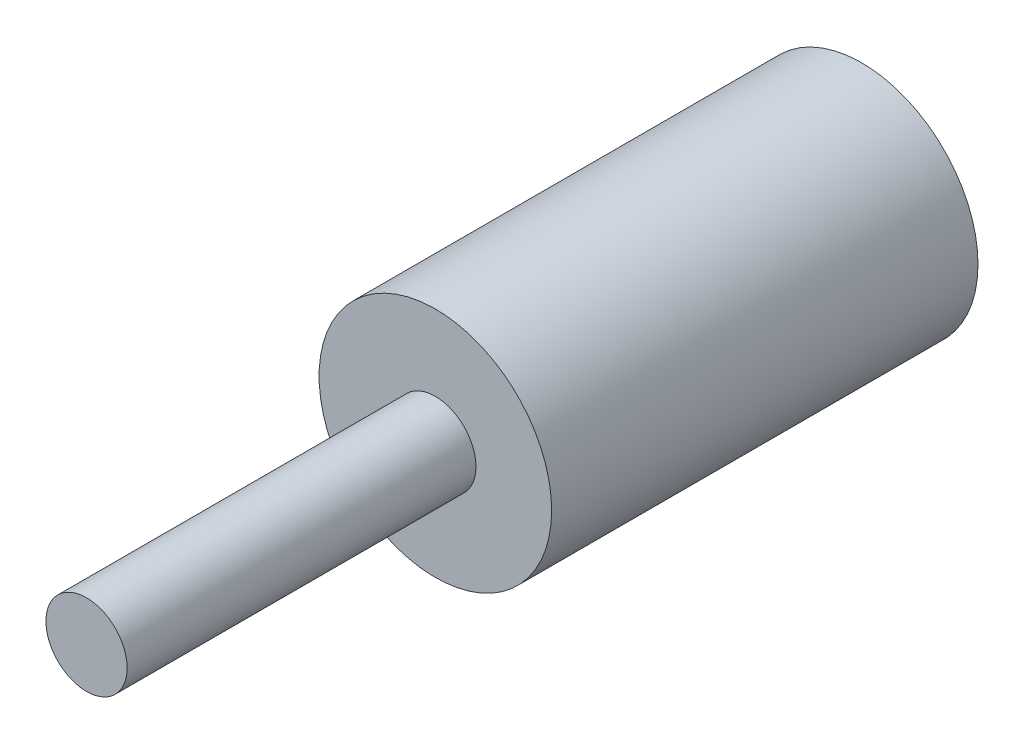
ISO-10303-21;
HEADER;
FILE_DESCRIPTION(('STEP AP214'),'2;1');
FILE_NAME('part.step','',(''),(''),'','','');
FILE_SCHEMA(('AUTOMOTIVE_DESIGN { 1 0 10303 214 1 1 1 1 }'));
ENDSEC;
DATA;
#1=APPLICATION_CONTEXT('core data for automotive mechanical design processes');
#2=APPLICATION_PROTOCOL_DEFINITION('international standard','automotive_design',2000,#1);
#3=PRODUCT_CONTEXT('',#1,'mechanical');
#4=PRODUCT('Part','Part','',(#3));
#5=PRODUCT_RELATED_PRODUCT_CATEGORY('part','',(#4));
#6=PRODUCT_DEFINITION_FORMATION('','',#4);
#7=PRODUCT_DEFINITION_CONTEXT('part definition',#1,'design');
#8=PRODUCT_DEFINITION('design','',#6,#7);
#9=PRODUCT_DEFINITION_SHAPE('','',#8);
#10=(LENGTH_UNIT() NAMED_UNIT(*) SI_UNIT(.MILLI.,.METRE.));
#11=(NAMED_UNIT(*) PLANE_ANGLE_UNIT() SI_UNIT($,.RADIAN.));
#12=(NAMED_UNIT(*) SI_UNIT($,.STERADIAN.) SOLID_ANGLE_UNIT());
#13=UNCERTAINTY_MEASURE_WITH_UNIT(LENGTH_MEASURE(1.E-05),#10,'distance_accuracy_value','');
#14=(GEOMETRIC_REPRESENTATION_CONTEXT(3) GLOBAL_UNCERTAINTY_ASSIGNED_CONTEXT((#13)) GLOBAL_UNIT_ASSIGNED_CONTEXT((#10,
#11,#12)) REPRESENTATION_CONTEXT('',''));
#15=CARTESIAN_POINT('',(0.,0.,0.));
#16=DIRECTION('',(0.,0.,1.));
#17=DIRECTION('',(1.,0.,0.));
#18=AXIS2_PLACEMENT_3D('',#15,#16,#17);
#19=CARTESIAN_POINT('',(0.,0.,40.));
#20=DIRECTION('',(0.,0.,-1.));
#21=DIRECTION('',(-1.,0.,0.));
#22=AXIS2_PLACEMENT_3D('',#19,#20,#21);
#23=CYLINDRICAL_SURFACE('',#22,6.);
#24=CARTESIAN_POINT('',(0.,0.,0.));
#25=DIRECTION('',(0.,0.,1.));
#26=DIRECTION('',(1.,0.,0.));
#27=AXIS2_PLACEMENT_3D('',#24,#25,#26);
#28=CIRCLE('',#27,6.);
#29=CARTESIAN_POINT('',(6.,0.,0.));
#30=VERTEX_POINT('',#29);
#31=EDGE_CURVE('E34',#30,#30,#28,.T.);
#32=ORIENTED_EDGE('',*,*,#31,.T.);
#33=EDGE_LOOP('',(#32));
#34=FACE_BOUND('',#33,.T.);
#35=CARTESIAN_POINT('',(0.,0.,22.));
#36=DIRECTION('',(0.,0.,1.));
#37=DIRECTION('',(1.,0.,0.));
#38=AXIS2_PLACEMENT_3D('',#35,#36,#37);
#39=CIRCLE('',#38,6.);
#40=CARTESIAN_POINT('',(6.,0.,22.));
#41=VERTEX_POINT('',#40);
#42=EDGE_CURVE('E46',#41,#41,#39,.T.);
#43=ORIENTED_EDGE('',*,*,#42,.F.);
#44=EDGE_LOOP('',(#43));
#45=FACE_BOUND('',#44,.T.);
#46=ADVANCED_FACE('F31',(#34,#45),#23,.T.);
#47=CARTESIAN_POINT('',(0.,0.,0.));
#48=DIRECTION('',(0.,0.,1.));
#49=DIRECTION('',(1.,0.,0.));
#50=AXIS2_PLACEMENT_3D('',#47,#48,#49);
#51=PLANE('',#50);
#52=CARTESIAN_POINT('',(0.,0.,0.));
#53=DIRECTION('',(0.,0.,-1.));
#54=DIRECTION('',(-1.,0.,0.));
#55=AXIS2_PLACEMENT_3D('',#52,#53,#54);
#56=CIRCLE('',#55,5.);
#57=CARTESIAN_POINT('',(-5.,0.,0.));
#58=VERTEX_POINT('',#57);
#59=EDGE_CURVE('E49',#58,#58,#56,.T.);
#60=ORIENTED_EDGE('',*,*,#59,.F.);
#61=EDGE_LOOP('',(#60));
#62=FACE_BOUND('',#61,.T.);
#63=ORIENTED_EDGE('',*,*,#31,.F.);
#64=EDGE_LOOP('',(#63));
#65=FACE_BOUND('',#64,.T.);
#66=ADVANCED_FACE('F56',(#62,#65),#51,.F.);
#67=CARTESIAN_POINT('',(0.,0.,20.));
#68=DIRECTION('',(0.,0.,-1.));
#69=DIRECTION('',(-1.,0.,0.));
#70=AXIS2_PLACEMENT_3D('',#67,#68,#69);
#71=CYLINDRICAL_SURFACE('',#70,5.);
#72=CARTESIAN_POINT('',(0.,0.,20.));
#73=DIRECTION('',(0.,0.,-1.));
#74=DIRECTION('',(-1.,0.,0.));
#75=AXIS2_PLACEMENT_3D('',#72,#73,#74);
#76=CIRCLE('',#75,5.);
#77=CARTESIAN_POINT('',(-5.,0.,20.));
#78=VERTEX_POINT('',#77);
#79=EDGE_CURVE('E42',#78,#78,#76,.T.);
#80=ORIENTED_EDGE('',*,*,#79,.F.);
#81=EDGE_LOOP('',(#80));
#82=FACE_BOUND('',#81,.T.);
#83=ORIENTED_EDGE('',*,*,#59,.T.);
#84=EDGE_LOOP('',(#83));
#85=FACE_BOUND('',#84,.T.);
#86=ADVANCED_FACE('F54',(#82,#85),#71,.F.);
#87=CARTESIAN_POINT('',(0.,0.,20.));
#88=DIRECTION('',(0.,0.,-1.));
#89=DIRECTION('',(-1.,0.,0.));
#90=AXIS2_PLACEMENT_3D('',#87,#88,#89);
#91=PLANE('',#90);
#92=ORIENTED_EDGE('',*,*,#79,.T.);
#93=EDGE_LOOP('',(#92));
#94=FACE_BOUND('',#93,.T.);
#95=ADVANCED_FACE('F68',(#94),#91,.T.);
#96=CARTESIAN_POINT('',(0.,0.,22.));
#97=DIRECTION('',(0.,0.,1.));
#98=DIRECTION('',(1.,0.,0.));
#99=AXIS2_PLACEMENT_3D('',#96,#97,#98);
#100=PLANE('',#99);
#101=CARTESIAN_POINT('',(0.,0.,22.));
#102=DIRECTION('',(0.,0.,1.));
#103=DIRECTION('',(1.,0.,0.));
#104=AXIS2_PLACEMENT_3D('',#101,#102,#103);
#105=CIRCLE('',#104,2.095);
#106=CARTESIAN_POINT('',(2.095,0.,22.));
#107=VERTEX_POINT('',#106);
#108=EDGE_CURVE('E10',#107,#107,#105,.T.);
#109=ORIENTED_EDGE('',*,*,#108,.F.);
#110=EDGE_LOOP('',(#109));
#111=FACE_BOUND('',#110,.T.);
#112=ORIENTED_EDGE('',*,*,#42,.T.);
#113=EDGE_LOOP('',(#112));
#114=FACE_BOUND('',#113,.T.);
#115=ADVANCED_FACE('F65',(#111,#114),#100,.T.);
#116=CARTESIAN_POINT('',(0.,0.,40.));
#117=DIRECTION('',(0.,0.,-1.));
#118=DIRECTION('',(-1.,0.,0.));
#119=AXIS2_PLACEMENT_3D('',#116,#117,#118);
#120=CYLINDRICAL_SURFACE('',#119,2.095);
#121=CARTESIAN_POINT('',(0.,0.,40.));
#122=DIRECTION('',(0.,0.,1.));
#123=DIRECTION('',(1.,0.,0.));
#124=AXIS2_PLACEMENT_3D('',#121,#122,#123);
#125=CIRCLE('',#124,2.095);
#126=CARTESIAN_POINT('',(2.095,0.,40.));
#127=VERTEX_POINT('',#126);
#128=EDGE_CURVE('E45',#127,#127,#125,.T.);
#129=ORIENTED_EDGE('',*,*,#128,.F.);
#130=EDGE_LOOP('',(#129));
#131=FACE_BOUND('',#130,.T.);
#132=ORIENTED_EDGE('',*,*,#108,.T.);
#133=EDGE_LOOP('',(#132));
#134=FACE_BOUND('',#133,.T.);
#135=ADVANCED_FACE('F67',(#131,#134),#120,.T.);
#136=CARTESIAN_POINT('',(0.,0.,40.));
#137=DIRECTION('',(0.,0.,1.));
#138=DIRECTION('',(1.,0.,0.));
#139=AXIS2_PLACEMENT_3D('',#136,#137,#138);
#140=PLANE('',#139);
#141=ORIENTED_EDGE('',*,*,#128,.T.);
#142=EDGE_LOOP('',(#141));
#143=FACE_BOUND('',#142,.T.);
#144=ADVANCED_FACE('F75',(#143),#140,.T.);
#145=CLOSED_SHELL('',(#46,#66,#86,#95,#115,#135,#144));
#146=MANIFOLD_SOLID_BREP('B2',#145);
#147=ADVANCED_BREP_SHAPE_REPRESENTATION('',(#18,#146),#14);
#148=SHAPE_DEFINITION_REPRESENTATION(#9,#147);
ENDSEC;
END-ISO-10303-21;
